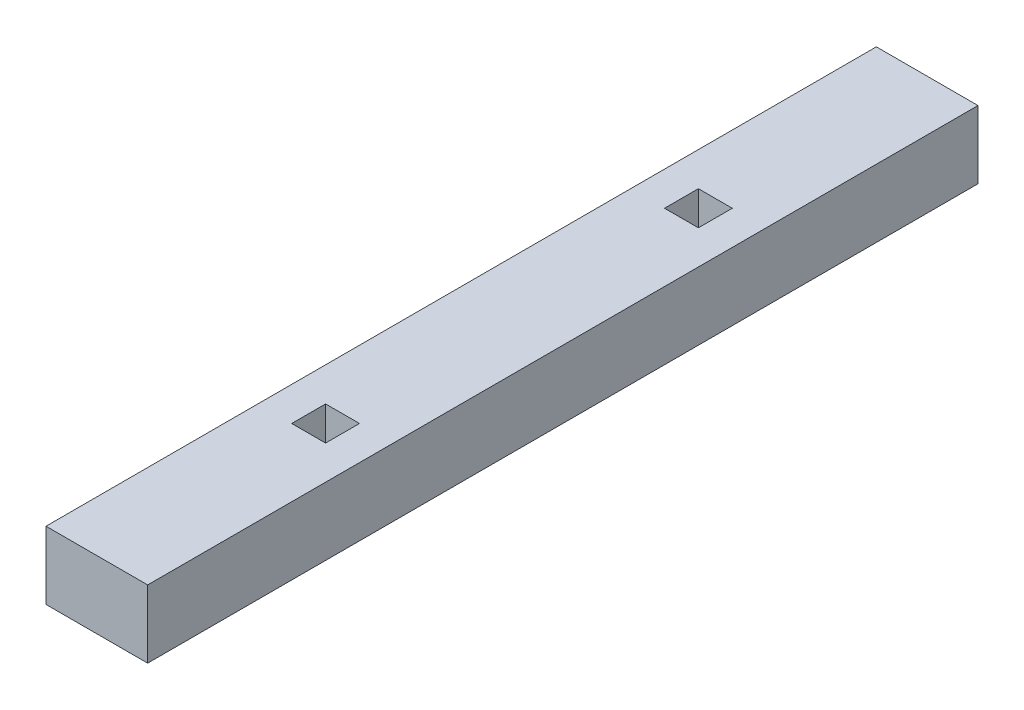
ISO-10303-21;
HEADER;
FILE_DESCRIPTION(('STEP AP214'),'2;1');
FILE_NAME('part.step','',(''),(''),'','','');
FILE_SCHEMA(('AUTOMOTIVE_DESIGN { 1 0 10303 214 1 1 1 1 }'));
ENDSEC;
DATA;
#1=APPLICATION_CONTEXT('core data for automotive mechanical design processes');
#2=APPLICATION_PROTOCOL_DEFINITION('international standard','automotive_design',2000,#1);
#3=PRODUCT_CONTEXT('',#1,'mechanical');
#4=PRODUCT('Part','Part','',(#3));
#5=PRODUCT_RELATED_PRODUCT_CATEGORY('part','',(#4));
#6=PRODUCT_DEFINITION_FORMATION('','',#4);
#7=PRODUCT_DEFINITION_CONTEXT('part definition',#1,'design');
#8=PRODUCT_DEFINITION('design','',#6,#7);
#9=PRODUCT_DEFINITION_SHAPE('','',#8);
#10=(LENGTH_UNIT() NAMED_UNIT(*) SI_UNIT(.MILLI.,.METRE.));
#11=(NAMED_UNIT(*) PLANE_ANGLE_UNIT() SI_UNIT($,.RADIAN.));
#12=(NAMED_UNIT(*) SI_UNIT($,.STERADIAN.) SOLID_ANGLE_UNIT());
#13=UNCERTAINTY_MEASURE_WITH_UNIT(LENGTH_MEASURE(1.E-05),#10,'distance_accuracy_value','');
#14=(GEOMETRIC_REPRESENTATION_CONTEXT(3) GLOBAL_UNCERTAINTY_ASSIGNED_CONTEXT((#13)) GLOBAL_UNIT_ASSIGNED_CONTEXT((#10,
#11,#12)) REPRESENTATION_CONTEXT('',''));
#15=CARTESIAN_POINT('',(0.,0.,0.));
#16=DIRECTION('',(0.,0.,1.));
#17=DIRECTION('',(1.,0.,0.));
#18=AXIS2_PLACEMENT_3D('',#15,#16,#17);
#19=CARTESIAN_POINT('',(0.,20.,0.));
#20=DIRECTION('',(0.,1.,0.));
#21=DIRECTION('',(0.,0.,1.));
#22=AXIS2_PLACEMENT_3D('',#19,#20,#21);
#23=PLANE('',#22);
#24=DIRECTION('',(0.,0.,1.));
#25=VECTOR('',#24,1.);
#26=CARTESIAN_POINT('',(-15.,20.,-117.5));
#27=LINE('',#26,#25);
#28=CARTESIAN_POINT('',(-15.,20.,-117.5));
#29=VERTEX_POINT('',#28);
#30=CARTESIAN_POINT('',(-15.,20.,127.5));
#31=VERTEX_POINT('',#30);
#32=EDGE_CURVE('E189',#29,#31,#27,.T.);
#33=ORIENTED_EDGE('',*,*,#32,.T.);
#34=DIRECTION('',(1.,0.,0.));
#35=VECTOR('',#34,1.);
#36=CARTESIAN_POINT('',(-15.,20.,127.5));
#37=LINE('',#36,#35);
#38=CARTESIAN_POINT('',(15.,20.,127.5));
#39=VERTEX_POINT('',#38);
#40=EDGE_CURVE('E192',#31,#39,#37,.T.);
#41=ORIENTED_EDGE('',*,*,#40,.T.);
#42=DIRECTION('',(0.,0.,-1.));
#43=VECTOR('',#42,1.);
#44=CARTESIAN_POINT('',(15.,20.,-117.5));
#45=LINE('',#44,#43);
#46=CARTESIAN_POINT('',(15.,20.,-117.5));
#47=VERTEX_POINT('',#46);
#48=EDGE_CURVE('E195',#39,#47,#45,.T.);
#49=ORIENTED_EDGE('',*,*,#48,.T.);
#50=DIRECTION('',(-1.,0.,0.));
#51=VECTOR('',#50,1.);
#52=CARTESIAN_POINT('',(-15.,20.,-117.5));
#53=LINE('',#52,#51);
#54=EDGE_CURVE('E197',#47,#29,#53,.T.);
#55=ORIENTED_EDGE('',*,*,#54,.T.);
#56=EDGE_LOOP('',(#33,#41,#49,#55));
#57=FACE_BOUND('',#56,.T.);
#58=DIRECTION('',(1.,0.,0.));
#59=VECTOR('',#58,1.);
#60=CARTESIAN_POINT('',(-5.,20.,-45.));
#61=LINE('',#60,#59);
#62=CARTESIAN_POINT('',(-5.,20.,-45.));
#63=VERTEX_POINT('',#62);
#64=CARTESIAN_POINT('',(5.,20.,-45.));
#65=VERTEX_POINT('',#64);
#66=EDGE_CURVE('E160',#63,#65,#61,.T.);
#67=ORIENTED_EDGE('',*,*,#66,.F.);
#68=DIRECTION('',(0.,0.,1.));
#69=VECTOR('',#68,1.);
#70=CARTESIAN_POINT('',(-5.,20.,-55.));
#71=LINE('',#70,#69);
#72=CARTESIAN_POINT('',(-5.,20.,-55.));
#73=VERTEX_POINT('',#72);
#74=EDGE_CURVE('E158',#73,#63,#71,.T.);
#75=ORIENTED_EDGE('',*,*,#74,.F.);
#76=DIRECTION('',(-1.,0.,0.));
#77=VECTOR('',#76,1.);
#78=CARTESIAN_POINT('',(-5.,20.,-55.));
#79=LINE('',#78,#77);
#80=CARTESIAN_POINT('',(5.,20.,-55.));
#81=VERTEX_POINT('',#80);
#82=EDGE_CURVE('E166',#81,#73,#79,.T.);
#83=ORIENTED_EDGE('',*,*,#82,.F.);
#84=DIRECTION('',(0.,0.,-1.));
#85=VECTOR('',#84,1.);
#86=CARTESIAN_POINT('',(5.,20.,-55.));
#87=LINE('',#86,#85);
#88=EDGE_CURVE('E163',#65,#81,#87,.T.);
#89=ORIENTED_EDGE('',*,*,#88,.F.);
#90=EDGE_LOOP('',(#67,#75,#83,#89));
#91=FACE_BOUND('',#90,.T.);
#92=DIRECTION('',(0.,0.,-1.));
#93=VECTOR('',#92,1.);
#94=CARTESIAN_POINT('',(5.,20.,65.));
#95=LINE('',#94,#93);
#96=CARTESIAN_POINT('',(5.,20.,65.));
#97=VERTEX_POINT('',#96);
#98=CARTESIAN_POINT('',(5.,20.,55.));
#99=VERTEX_POINT('',#98);
#100=EDGE_CURVE('E130',#97,#99,#95,.T.);
#101=ORIENTED_EDGE('',*,*,#100,.F.);
#102=DIRECTION('',(1.,0.,0.));
#103=VECTOR('',#102,1.);
#104=CARTESIAN_POINT('',(-5.,20.,65.));
#105=LINE('',#104,#103);
#106=CARTESIAN_POINT('',(-5.,20.,65.));
#107=VERTEX_POINT('',#106);
#108=EDGE_CURVE('E122',#107,#97,#105,.T.);
#109=ORIENTED_EDGE('',*,*,#108,.F.);
#110=DIRECTION('',(0.,0.,1.));
#111=VECTOR('',#110,1.);
#112=CARTESIAN_POINT('',(-5.,20.,65.));
#113=LINE('',#112,#111);
#114=CARTESIAN_POINT('',(-5.,20.,55.));
#115=VERTEX_POINT('',#114);
#116=EDGE_CURVE('E144',#115,#107,#113,.T.);
#117=ORIENTED_EDGE('',*,*,#116,.F.);
#118=DIRECTION('',(-1.,0.,0.));
#119=VECTOR('',#118,1.);
#120=CARTESIAN_POINT('',(-5.,20.,55.));
#121=LINE('',#120,#119);
#122=EDGE_CURVE('E142',#99,#115,#121,.T.);
#123=ORIENTED_EDGE('',*,*,#122,.F.);
#124=EDGE_LOOP('',(#101,#109,#117,#123));
#125=FACE_BOUND('',#124,.T.);
#126=ADVANCED_FACE('F33',(#57,#91,#125),#23,.T.);
#127=CARTESIAN_POINT('',(0.,0.,0.));
#128=DIRECTION('',(0.,1.,0.));
#129=DIRECTION('',(0.,0.,1.));
#130=AXIS2_PLACEMENT_3D('',#127,#128,#129);
#131=PLANE('',#130);
#132=DIRECTION('',(0.,0.,1.));
#133=VECTOR('',#132,1.);
#134=CARTESIAN_POINT('',(-5.,0.,-55.));
#135=LINE('',#134,#133);
#136=CARTESIAN_POINT('',(-5.,0.,-55.));
#137=VERTEX_POINT('',#136);
#138=CARTESIAN_POINT('',(-5.,0.,-45.));
#139=VERTEX_POINT('',#138);
#140=EDGE_CURVE('E138',#137,#139,#135,.T.);
#141=ORIENTED_EDGE('',*,*,#140,.T.);
#142=DIRECTION('',(1.,0.,0.));
#143=VECTOR('',#142,1.);
#144=CARTESIAN_POINT('',(-5.,0.,-45.));
#145=LINE('',#144,#143);
#146=CARTESIAN_POINT('',(5.,0.,-45.));
#147=VERTEX_POINT('',#146);
#148=EDGE_CURVE('E171',#139,#147,#145,.T.);
#149=ORIENTED_EDGE('',*,*,#148,.T.);
#150=DIRECTION('',(0.,0.,-1.));
#151=VECTOR('',#150,1.);
#152=CARTESIAN_POINT('',(5.,0.,-55.));
#153=LINE('',#152,#151);
#154=CARTESIAN_POINT('',(5.,0.,-55.));
#155=VERTEX_POINT('',#154);
#156=EDGE_CURVE('E174',#147,#155,#153,.T.);
#157=ORIENTED_EDGE('',*,*,#156,.T.);
#158=DIRECTION('',(-1.,0.,0.));
#159=VECTOR('',#158,1.);
#160=CARTESIAN_POINT('',(-5.,0.,-55.));
#161=LINE('',#160,#159);
#162=EDGE_CURVE('E161',#155,#137,#161,.T.);
#163=ORIENTED_EDGE('',*,*,#162,.T.);
#164=EDGE_LOOP('',(#141,#149,#157,#163));
#165=FACE_BOUND('',#164,.T.);
#166=DIRECTION('',(0.,0.,1.));
#167=VECTOR('',#166,1.);
#168=CARTESIAN_POINT('',(-15.,0.,-117.5));
#169=LINE('',#168,#167);
#170=CARTESIAN_POINT('',(-15.,0.,-117.5));
#171=VERTEX_POINT('',#170);
#172=CARTESIAN_POINT('',(-15.,0.,127.5));
#173=VERTEX_POINT('',#172);
#174=EDGE_CURVE('E188',#171,#173,#169,.T.);
#175=ORIENTED_EDGE('',*,*,#174,.F.);
#176=DIRECTION('',(-1.,0.,0.));
#177=VECTOR('',#176,1.);
#178=CARTESIAN_POINT('',(-15.,0.,-117.5));
#179=LINE('',#178,#177);
#180=CARTESIAN_POINT('',(15.,0.,-117.5));
#181=VERTEX_POINT('',#180);
#182=EDGE_CURVE('E193',#181,#171,#179,.T.);
#183=ORIENTED_EDGE('',*,*,#182,.F.);
#184=DIRECTION('',(0.,0.,-1.));
#185=VECTOR('',#184,1.);
#186=CARTESIAN_POINT('',(15.,0.,-117.5));
#187=LINE('',#186,#185);
#188=CARTESIAN_POINT('',(15.,0.,127.5));
#189=VERTEX_POINT('',#188);
#190=EDGE_CURVE('E204',#189,#181,#187,.T.);
#191=ORIENTED_EDGE('',*,*,#190,.F.);
#192=DIRECTION('',(1.,0.,0.));
#193=VECTOR('',#192,1.);
#194=CARTESIAN_POINT('',(-15.,0.,127.5));
#195=LINE('',#194,#193);
#196=EDGE_CURVE('E202',#173,#189,#195,.T.);
#197=ORIENTED_EDGE('',*,*,#196,.F.);
#198=EDGE_LOOP('',(#175,#183,#191,#197));
#199=FACE_BOUND('',#198,.T.);
#200=DIRECTION('',(1.,0.,0.));
#201=VECTOR('',#200,1.);
#202=CARTESIAN_POINT('',(-5.,0.,65.));
#203=LINE('',#202,#201);
#204=CARTESIAN_POINT('',(-5.,0.,65.));
#205=VERTEX_POINT('',#204);
#206=CARTESIAN_POINT('',(5.,0.,65.));
#207=VERTEX_POINT('',#206);
#208=EDGE_CURVE('E56',#205,#207,#203,.T.);
#209=ORIENTED_EDGE('',*,*,#208,.T.);
#210=DIRECTION('',(0.,0.,-1.));
#211=VECTOR('',#210,1.);
#212=CARTESIAN_POINT('',(5.,0.,65.));
#213=LINE('',#212,#211);
#214=CARTESIAN_POINT('',(5.,0.,55.));
#215=VERTEX_POINT('',#214);
#216=EDGE_CURVE('E137',#207,#215,#213,.T.);
#217=ORIENTED_EDGE('',*,*,#216,.T.);
#218=DIRECTION('',(-1.,0.,0.));
#219=VECTOR('',#218,1.);
#220=CARTESIAN_POINT('',(-5.,0.,55.));
#221=LINE('',#220,#219);
#222=CARTESIAN_POINT('',(-5.,0.,55.));
#223=VERTEX_POINT('',#222);
#224=EDGE_CURVE('E150',#215,#223,#221,.T.);
#225=ORIENTED_EDGE('',*,*,#224,.T.);
#226=DIRECTION('',(0.,0.,1.));
#227=VECTOR('',#226,1.);
#228=CARTESIAN_POINT('',(-5.,0.,65.));
#229=LINE('',#228,#227);
#230=EDGE_CURVE('E131',#223,#205,#229,.T.);
#231=ORIENTED_EDGE('',*,*,#230,.T.);
#232=EDGE_LOOP('',(#209,#217,#225,#231));
#233=FACE_BOUND('',#232,.T.);
#234=ADVANCED_FACE('F222',(#165,#199,#233),#131,.F.);
#235=CARTESIAN_POINT('',(-15.,20.,-117.5));
#236=DIRECTION('',(1.,0.,0.));
#237=DIRECTION('',(0.,0.,-1.));
#238=AXIS2_PLACEMENT_3D('',#235,#236,#237);
#239=PLANE('',#238);
#240=ORIENTED_EDGE('',*,*,#174,.T.);
#241=DIRECTION('',(0.,-1.,0.));
#242=VECTOR('',#241,1.);
#243=CARTESIAN_POINT('',(-15.,20.,127.5));
#244=LINE('',#243,#242);
#245=EDGE_CURVE('E11',#31,#173,#244,.T.);
#246=ORIENTED_EDGE('',*,*,#245,.F.);
#247=ORIENTED_EDGE('',*,*,#32,.F.);
#248=DIRECTION('',(0.,-1.,0.));
#249=VECTOR('',#248,1.);
#250=CARTESIAN_POINT('',(-15.,20.,-117.5));
#251=LINE('',#250,#249);
#252=EDGE_CURVE('E199',#29,#171,#251,.T.);
#253=ORIENTED_EDGE('',*,*,#252,.T.);
#254=EDGE_LOOP('',(#240,#246,#247,#253));
#255=FACE_BOUND('',#254,.T.);
#256=ADVANCED_FACE('F35',(#255),#239,.F.);
#257=CARTESIAN_POINT('',(-15.,20.,127.5));
#258=DIRECTION('',(0.,0.,-1.));
#259=DIRECTION('',(-1.,0.,0.));
#260=AXIS2_PLACEMENT_3D('',#257,#258,#259);
#261=PLANE('',#260);
#262=ORIENTED_EDGE('',*,*,#196,.T.);
#263=DIRECTION('',(0.,-1.,0.));
#264=VECTOR('',#263,1.);
#265=CARTESIAN_POINT('',(15.,20.,127.5));
#266=LINE('',#265,#264);
#267=EDGE_CURVE('E41',#39,#189,#266,.T.);
#268=ORIENTED_EDGE('',*,*,#267,.F.);
#269=ORIENTED_EDGE('',*,*,#40,.F.);
#270=ORIENTED_EDGE('',*,*,#245,.T.);
#271=EDGE_LOOP('',(#262,#268,#269,#270));
#272=FACE_BOUND('',#271,.T.);
#273=ADVANCED_FACE('F233',(#272),#261,.F.);
#274=CARTESIAN_POINT('',(15.,20.,-117.5));
#275=DIRECTION('',(-1.,0.,0.));
#276=DIRECTION('',(0.,0.,1.));
#277=AXIS2_PLACEMENT_3D('',#274,#275,#276);
#278=PLANE('',#277);
#279=ORIENTED_EDGE('',*,*,#190,.T.);
#280=DIRECTION('',(0.,-1.,0.));
#281=VECTOR('',#280,1.);
#282=CARTESIAN_POINT('',(15.,20.,-117.5));
#283=LINE('',#282,#281);
#284=EDGE_CURVE('E209',#47,#181,#283,.T.);
#285=ORIENTED_EDGE('',*,*,#284,.F.);
#286=ORIENTED_EDGE('',*,*,#48,.F.);
#287=ORIENTED_EDGE('',*,*,#267,.T.);
#288=EDGE_LOOP('',(#279,#285,#286,#287));
#289=FACE_BOUND('',#288,.T.);
#290=ADVANCED_FACE('F216',(#289),#278,.F.);
#291=CARTESIAN_POINT('',(-15.,20.,-117.5));
#292=DIRECTION('',(0.,0.,1.));
#293=DIRECTION('',(1.,0.,0.));
#294=AXIS2_PLACEMENT_3D('',#291,#292,#293);
#295=PLANE('',#294);
#296=ORIENTED_EDGE('',*,*,#182,.T.);
#297=ORIENTED_EDGE('',*,*,#252,.F.);
#298=ORIENTED_EDGE('',*,*,#54,.F.);
#299=ORIENTED_EDGE('',*,*,#284,.T.);
#300=EDGE_LOOP('',(#296,#297,#298,#299));
#301=FACE_BOUND('',#300,.T.);
#302=ADVANCED_FACE('F226',(#301),#295,.F.);
#303=CARTESIAN_POINT('',(-5.,20.,-55.));
#304=DIRECTION('',(1.,0.,0.));
#305=DIRECTION('',(0.,0.,-1.));
#306=AXIS2_PLACEMENT_3D('',#303,#304,#305);
#307=PLANE('',#306);
#308=ORIENTED_EDGE('',*,*,#140,.F.);
#309=DIRECTION('',(0.,-1.,0.));
#310=VECTOR('',#309,1.);
#311=CARTESIAN_POINT('',(-5.,20.,-55.));
#312=LINE('',#311,#310);
#313=EDGE_CURVE('E168',#73,#137,#312,.T.);
#314=ORIENTED_EDGE('',*,*,#313,.F.);
#315=ORIENTED_EDGE('',*,*,#74,.T.);
#316=DIRECTION('',(0.,-1.,0.));
#317=VECTOR('',#316,1.);
#318=CARTESIAN_POINT('',(-5.,20.,-45.));
#319=LINE('',#318,#317);
#320=EDGE_CURVE('E185',#63,#139,#319,.T.);
#321=ORIENTED_EDGE('',*,*,#320,.T.);
#322=EDGE_LOOP('',(#308,#314,#315,#321));
#323=FACE_BOUND('',#322,.T.);
#324=ADVANCED_FACE('F248',(#323),#307,.T.);
#325=CARTESIAN_POINT('',(-5.,20.,-45.));
#326=DIRECTION('',(0.,0.,-1.));
#327=DIRECTION('',(-1.,0.,0.));
#328=AXIS2_PLACEMENT_3D('',#325,#326,#327);
#329=PLANE('',#328);
#330=ORIENTED_EDGE('',*,*,#148,.F.);
#331=ORIENTED_EDGE('',*,*,#320,.F.);
#332=ORIENTED_EDGE('',*,*,#66,.T.);
#333=DIRECTION('',(0.,-1.,0.));
#334=VECTOR('',#333,1.);
#335=CARTESIAN_POINT('',(5.,20.,-45.));
#336=LINE('',#335,#334);
#337=EDGE_CURVE('E183',#65,#147,#336,.T.);
#338=ORIENTED_EDGE('',*,*,#337,.T.);
#339=EDGE_LOOP('',(#330,#331,#332,#338));
#340=FACE_BOUND('',#339,.T.);
#341=ADVANCED_FACE('F255',(#340),#329,.T.);
#342=CARTESIAN_POINT('',(5.,20.,-55.));
#343=DIRECTION('',(-1.,0.,0.));
#344=DIRECTION('',(0.,0.,1.));
#345=AXIS2_PLACEMENT_3D('',#342,#343,#344);
#346=PLANE('',#345);
#347=ORIENTED_EDGE('',*,*,#156,.F.);
#348=ORIENTED_EDGE('',*,*,#337,.F.);
#349=ORIENTED_EDGE('',*,*,#88,.T.);
#350=DIRECTION('',(0.,-1.,0.));
#351=VECTOR('',#350,1.);
#352=CARTESIAN_POINT('',(5.,20.,-55.));
#353=LINE('',#352,#351);
#354=EDGE_CURVE('E181',#81,#155,#353,.T.);
#355=ORIENTED_EDGE('',*,*,#354,.T.);
#356=EDGE_LOOP('',(#347,#348,#349,#355));
#357=FACE_BOUND('',#356,.T.);
#358=ADVANCED_FACE('F260',(#357),#346,.T.);
#359=CARTESIAN_POINT('',(-5.,20.,-55.));
#360=DIRECTION('',(0.,0.,1.));
#361=DIRECTION('',(1.,0.,0.));
#362=AXIS2_PLACEMENT_3D('',#359,#360,#361);
#363=PLANE('',#362);
#364=ORIENTED_EDGE('',*,*,#162,.F.);
#365=ORIENTED_EDGE('',*,*,#354,.F.);
#366=ORIENTED_EDGE('',*,*,#82,.T.);
#367=ORIENTED_EDGE('',*,*,#313,.T.);
#368=EDGE_LOOP('',(#364,#365,#366,#367));
#369=FACE_BOUND('',#368,.T.);
#370=ADVANCED_FACE('F267',(#369),#363,.T.);
#371=CARTESIAN_POINT('',(-5.,20.,65.));
#372=DIRECTION('',(0.,0.,-1.));
#373=DIRECTION('',(-1.,0.,0.));
#374=AXIS2_PLACEMENT_3D('',#371,#372,#373);
#375=PLANE('',#374);
#376=ORIENTED_EDGE('',*,*,#208,.F.);
#377=DIRECTION('',(0.,-1.,0.));
#378=VECTOR('',#377,1.);
#379=CARTESIAN_POINT('',(-5.,20.,65.));
#380=LINE('',#379,#378);
#381=EDGE_CURVE('E126',#107,#205,#380,.T.);
#382=ORIENTED_EDGE('',*,*,#381,.F.);
#383=ORIENTED_EDGE('',*,*,#108,.T.);
#384=DIRECTION('',(0.,-1.,0.));
#385=VECTOR('',#384,1.);
#386=CARTESIAN_POINT('',(5.,20.,65.));
#387=LINE('',#386,#385);
#388=EDGE_CURVE('E125',#97,#207,#387,.T.);
#389=ORIENTED_EDGE('',*,*,#388,.T.);
#390=EDGE_LOOP('',(#376,#382,#383,#389));
#391=FACE_BOUND('',#390,.T.);
#392=ADVANCED_FACE('F124',(#391),#375,.T.);
#393=CARTESIAN_POINT('',(5.,20.,65.));
#394=DIRECTION('',(-1.,0.,0.));
#395=DIRECTION('',(0.,0.,1.));
#396=AXIS2_PLACEMENT_3D('',#393,#394,#395);
#397=PLANE('',#396);
#398=ORIENTED_EDGE('',*,*,#216,.F.);
#399=ORIENTED_EDGE('',*,*,#388,.F.);
#400=ORIENTED_EDGE('',*,*,#100,.T.);
#401=DIRECTION('',(0.,-1.,0.));
#402=VECTOR('',#401,1.);
#403=CARTESIAN_POINT('',(5.,20.,55.));
#404=LINE('',#403,#402);
#405=EDGE_CURVE('E139',#99,#215,#404,.T.);
#406=ORIENTED_EDGE('',*,*,#405,.T.);
#407=EDGE_LOOP('',(#398,#399,#400,#406));
#408=FACE_BOUND('',#407,.T.);
#409=ADVANCED_FACE('F134',(#408),#397,.T.);
#410=CARTESIAN_POINT('',(-5.,20.,55.));
#411=DIRECTION('',(0.,0.,1.));
#412=DIRECTION('',(1.,0.,0.));
#413=AXIS2_PLACEMENT_3D('',#410,#411,#412);
#414=PLANE('',#413);
#415=ORIENTED_EDGE('',*,*,#224,.F.);
#416=ORIENTED_EDGE('',*,*,#405,.F.);
#417=ORIENTED_EDGE('',*,*,#122,.T.);
#418=DIRECTION('',(0.,-1.,0.));
#419=VECTOR('',#418,1.);
#420=CARTESIAN_POINT('',(-5.,20.,55.));
#421=LINE('',#420,#419);
#422=EDGE_CURVE('E48',#115,#223,#421,.T.);
#423=ORIENTED_EDGE('',*,*,#422,.T.);
#424=EDGE_LOOP('',(#415,#416,#417,#423));
#425=FACE_BOUND('',#424,.T.);
#426=ADVANCED_FACE('F285',(#425),#414,.T.);
#427=CARTESIAN_POINT('',(-5.,20.,65.));
#428=DIRECTION('',(1.,0.,0.));
#429=DIRECTION('',(0.,0.,-1.));
#430=AXIS2_PLACEMENT_3D('',#427,#428,#429);
#431=PLANE('',#430);
#432=ORIENTED_EDGE('',*,*,#230,.F.);
#433=ORIENTED_EDGE('',*,*,#422,.F.);
#434=ORIENTED_EDGE('',*,*,#116,.T.);
#435=ORIENTED_EDGE('',*,*,#381,.T.);
#436=EDGE_LOOP('',(#432,#433,#434,#435));
#437=FACE_BOUND('',#436,.T.);
#438=ADVANCED_FACE('F288',(#437),#431,.T.);
#439=CLOSED_SHELL('',(#126,#234,#256,#273,#290,#302,#324,#341,#358,#370,#392,#409,#426,#438));
#440=MANIFOLD_SOLID_BREP('B2',#439);
#441=ADVANCED_BREP_SHAPE_REPRESENTATION('',(#18,#440),#14);
#442=SHAPE_DEFINITION_REPRESENTATION(#9,#441);
ENDSEC;
END-ISO-10303-21;
